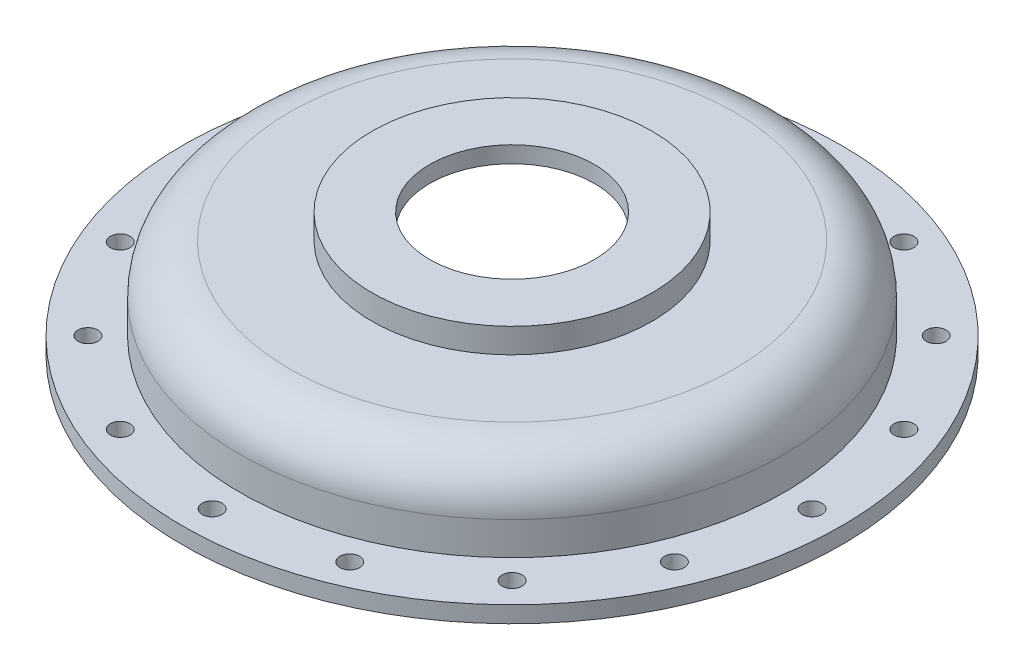
ISO-10303-21;
HEADER;
FILE_DESCRIPTION(('STEP AP214'),'2;1');
FILE_NAME('part.step','',(''),(''),'','','');
FILE_SCHEMA(('AUTOMOTIVE_DESIGN { 1 0 10303 214 1 1 1 1 }'));
ENDSEC;
DATA;
#1=APPLICATION_CONTEXT('core data for automotive mechanical design processes');
#2=APPLICATION_PROTOCOL_DEFINITION('international standard','automotive_design',2000,#1);
#3=PRODUCT_CONTEXT('',#1,'mechanical');
#4=PRODUCT('Part','Part','',(#3));
#5=PRODUCT_RELATED_PRODUCT_CATEGORY('part','',(#4));
#6=PRODUCT_DEFINITION_FORMATION('','',#4);
#7=PRODUCT_DEFINITION_CONTEXT('part definition',#1,'design');
#8=PRODUCT_DEFINITION('design','',#6,#7);
#9=PRODUCT_DEFINITION_SHAPE('','',#8);
#10=(LENGTH_UNIT() NAMED_UNIT(*) SI_UNIT(.MILLI.,.METRE.));
#11=(NAMED_UNIT(*) PLANE_ANGLE_UNIT() SI_UNIT($,.RADIAN.));
#12=(NAMED_UNIT(*) SI_UNIT($,.STERADIAN.) SOLID_ANGLE_UNIT());
#13=UNCERTAINTY_MEASURE_WITH_UNIT(LENGTH_MEASURE(1.E-05),#10,'distance_accuracy_value','');
#14=(GEOMETRIC_REPRESENTATION_CONTEXT(3) GLOBAL_UNCERTAINTY_ASSIGNED_CONTEXT((#13)) GLOBAL_UNIT_ASSIGNED_CONTEXT((#10,
#11,#12)) REPRESENTATION_CONTEXT('',''));
#15=CARTESIAN_POINT('',(0.,0.,0.));
#16=DIRECTION('',(0.,0.,1.));
#17=DIRECTION('',(1.,0.,0.));
#18=AXIS2_PLACEMENT_3D('',#15,#16,#17);
#19=CARTESIAN_POINT('',(1905.,1651.,0.));
#20=DIRECTION('',(0.,-1.,0.));
#21=DIRECTION('',(0.,0.,-1.));
#22=AXIS2_PLACEMENT_3D('',#19,#20,#21);
#23=PLANE('',#22);
#24=CARTESIAN_POINT('',(0.,1651.,0.));
#25=DIRECTION('',(0.,-1.,0.));
#26=DIRECTION('',(0.,0.,-1.));
#27=AXIS2_PLACEMENT_3D('',#24,#25,#26);
#28=CIRCLE('',#27,1270.);
#29=CARTESIAN_POINT('',(0.,1651.,-1270.));
#30=VERTEX_POINT('',#29);
#31=EDGE_CURVE('E80',#30,#30,#28,.T.);
#32=ORIENTED_EDGE('',*,*,#31,.F.);
#33=EDGE_LOOP('',(#32));
#34=FACE_BOUND('',#33,.T.);
#35=CARTESIAN_POINT('',(0.,1651.,0.));
#36=DIRECTION('',(0.,-1.,0.));
#37=DIRECTION('',(0.,0.,-1.));
#38=AXIS2_PLACEMENT_3D('',#35,#36,#37);
#39=CIRCLE('',#38,1905.);
#40=CARTESIAN_POINT('',(0.,1651.,-1905.));
#41=VERTEX_POINT('',#40);
#42=EDGE_CURVE('E10',#41,#41,#39,.T.);
#43=ORIENTED_EDGE('',*,*,#42,.T.);
#44=EDGE_LOOP('',(#43));
#45=FACE_BOUND('',#44,.T.);
#46=ADVANCED_FACE('F37',(#34,#45),#23,.T.);
#47=CARTESIAN_POINT('',(0.,0.,0.));
#48=DIRECTION('',(0.,-1.,0.));
#49=DIRECTION('',(0.,0.,-1.));
#50=AXIS2_PLACEMENT_3D('',#47,#48,#49);
#51=CYLINDRICAL_SURFACE('',#50,1905.);
#52=CARTESIAN_POINT('',(0.,1270.,0.));
#53=DIRECTION('',(0.,-1.,0.));
#54=DIRECTION('',(0.,0.,-1.));
#55=AXIS2_PLACEMENT_3D('',#52,#53,#54);
#56=CIRCLE('',#55,1905.);
#57=CARTESIAN_POINT('',(0.,1270.,-1905.));
#58=VERTEX_POINT('',#57);
#59=EDGE_CURVE('E43',#58,#58,#56,.T.);
#60=ORIENTED_EDGE('',*,*,#59,.T.);
#61=EDGE_LOOP('',(#60));
#62=FACE_BOUND('',#61,.T.);
#63=ORIENTED_EDGE('',*,*,#42,.F.);
#64=EDGE_LOOP('',(#63));
#65=FACE_BOUND('',#64,.T.);
#66=ADVANCED_FACE('F245',(#62,#65),#51,.F.);
#67=CARTESIAN_POINT('',(3174.99999999999,1270.,0.));
#68=DIRECTION('',(0.,-1.,0.));
#69=DIRECTION('',(0.,0.,-1.));
#70=AXIS2_PLACEMENT_3D('',#67,#68,#69);
#71=PLANE('',#70);
#72=CARTESIAN_POINT('',(0.,1270.,0.));
#73=DIRECTION('',(0.,-1.,0.));
#74=DIRECTION('',(0.,0.,-1.));
#75=AXIS2_PLACEMENT_3D('',#72,#73,#74);
#76=CIRCLE('',#75,3174.99999999999);
#77=CARTESIAN_POINT('',(0.,1270.,-3174.99999999999));
#78=VERTEX_POINT('',#77);
#79=EDGE_CURVE('E47',#78,#78,#76,.T.);
#80=ORIENTED_EDGE('',*,*,#79,.T.);
#81=EDGE_LOOP('',(#80));
#82=FACE_BOUND('',#81,.T.);
#83=ORIENTED_EDGE('',*,*,#59,.F.);
#84=EDGE_LOOP('',(#83));
#85=FACE_BOUND('',#84,.T.);
#86=ADVANCED_FACE('F239',(#82,#85),#71,.T.);
#87=CARTESIAN_POINT('',(0.,507.999999999999,0.));
#88=DIRECTION('',(0.,-1.,0.));
#89=DIRECTION('',(0.,0.,-1.));
#90=AXIS2_PLACEMENT_3D('',#87,#88,#89);
#91=TOROIDAL_SURFACE('',#90,3175.,762.);
#92=CARTESIAN_POINT('',(0.,507.999999999993,0.));
#93=DIRECTION('',(0.,-1.,0.));
#94=DIRECTION('',(0.,0.,-1.));
#95=AXIS2_PLACEMENT_3D('',#92,#93,#94);
#96=CIRCLE('',#95,3937.);
#97=CARTESIAN_POINT('',(0.,507.999999999993,-3937.));
#98=VERTEX_POINT('',#97);
#99=EDGE_CURVE('E51',#98,#98,#96,.T.);
#100=ORIENTED_EDGE('',*,*,#99,.T.);
#101=EDGE_LOOP('',(#100));
#102=FACE_BOUND('',#101,.T.);
#103=ORIENTED_EDGE('',*,*,#79,.F.);
#104=EDGE_LOOP('',(#103));
#105=FACE_BOUND('',#104,.T.);
#106=ADVANCED_FACE('F233',(#102,#105),#91,.F.);
#107=CARTESIAN_POINT('',(0.,0.,0.));
#108=DIRECTION('',(0.,-1.,0.));
#109=DIRECTION('',(0.,0.,-1.));
#110=AXIS2_PLACEMENT_3D('',#107,#108,#109);
#111=CYLINDRICAL_SURFACE('',#110,3937.);
#112=CARTESIAN_POINT('',(0.,-1.39977129142543E-13,0.));
#113=DIRECTION('',(0.,-1.,0.));
#114=DIRECTION('',(0.,0.,-1.));
#115=AXIS2_PLACEMENT_3D('',#112,#113,#114);
#116=CIRCLE('',#115,3937.);
#117=CARTESIAN_POINT('',(0.,-1.39977129142543E-13,-3937.));
#118=VERTEX_POINT('',#117);
#119=EDGE_CURVE('E56',#118,#118,#116,.T.);
#120=ORIENTED_EDGE('',*,*,#119,.T.);
#121=EDGE_LOOP('',(#120));
#122=FACE_BOUND('',#121,.T.);
#123=ORIENTED_EDGE('',*,*,#99,.F.);
#124=EDGE_LOOP('',(#123));
#125=FACE_BOUND('',#124,.T.);
#126=ADVANCED_FACE('F226',(#122,#125),#111,.F.);
#127=CARTESIAN_POINT('',(5080.,0.,0.));
#128=DIRECTION('',(0.,-1.,0.));
#129=DIRECTION('',(0.,0.,-1.));
#130=AXIS2_PLACEMENT_3D('',#127,#128,#129);
#131=PLANE('',#130);
#132=CARTESIAN_POINT('',(3268.81322806918,-1.66533453693773E-13,-3268.81322806917));
#133=DIRECTION('',(0.,1.,0.));
#134=DIRECTION('',(-0.707106781186549,0.,0.707106781186546));
#135=AXIS2_PLACEMENT_3D('',#132,#133,#134);
#136=CIRCLE('',#135,152.4);
#137=CARTESIAN_POINT('',(3161.05015461635,-1.66533453693773E-13,-3161.05015461634));
#138=VERTEX_POINT('',#137);
#139=EDGE_CURVE('E96',#138,#138,#136,.T.);
#140=ORIENTED_EDGE('',*,*,#139,.T.);
#141=EDGE_LOOP('',(#140));
#142=FACE_BOUND('',#141,.T.);
#143=CARTESIAN_POINT('',(4270.91030289318,-1.66533453693773E-13,-1769.06897113733));
#144=DIRECTION('',(0.,1.,0.));
#145=DIRECTION('',(-0.923879532511288,0.,0.382683432365087));
#146=AXIS2_PLACEMENT_3D('',#143,#144,#145);
#147=CIRCLE('',#146,152.4);
#148=CARTESIAN_POINT('',(4130.11106213846,-1.66533453693773E-13,-1710.74801604489));
#149=VERTEX_POINT('',#148);
#150=EDGE_CURVE('E139',#149,#149,#147,.T.);
#151=ORIENTED_EDGE('',*,*,#150,.T.);
#152=EDGE_LOOP('',(#151));
#153=FACE_BOUND('',#152,.T.);
#154=CARTESIAN_POINT('',(4622.8,-1.66533453693773E-13,1.6140419933204E-11));
#155=DIRECTION('',(0.,1.,0.));
#156=DIRECTION('',(-1.,0.,0.));
#157=AXIS2_PLACEMENT_3D('',#154,#155,#156);
#158=CIRCLE('',#157,152.4);
#159=CARTESIAN_POINT('',(4470.4,-1.66533453693773E-13,1.56083181771643E-11));
#160=VERTEX_POINT('',#159);
#161=EDGE_CURVE('E133',#160,#160,#158,.T.);
#162=ORIENTED_EDGE('',*,*,#161,.T.);
#163=EDGE_LOOP('',(#162));
#164=FACE_BOUND('',#163,.T.);
#165=CARTESIAN_POINT('',(4270.91030289317,-1.66533453693773E-13,1769.06897113736));
#166=DIRECTION('',(0.,1.,0.));
#167=DIRECTION('',(-0.923879532511285,0.,-0.382683432365094));
#168=AXIS2_PLACEMENT_3D('',#165,#166,#167);
#169=CIRCLE('',#168,152.4);
#170=CARTESIAN_POINT('',(4130.11106213845,-1.66533453693773E-13,1710.74801604492));
#171=VERTEX_POINT('',#170);
#172=EDGE_CURVE('E127',#171,#171,#169,.T.);
#173=ORIENTED_EDGE('',*,*,#172,.T.);
#174=EDGE_LOOP('',(#173));
#175=FACE_BOUND('',#174,.T.);
#176=CARTESIAN_POINT('',(3268.81322806915,-1.66533453693773E-13,3268.81322806919));
#177=DIRECTION('',(0.,1.,0.));
#178=DIRECTION('',(-0.707106781186544,0.,-0.707106781186551));
#179=AXIS2_PLACEMENT_3D('',#176,#177,#178);
#180=CIRCLE('',#179,152.4);
#181=CARTESIAN_POINT('',(3161.05015461633,-1.66533453693773E-13,3161.05015461636));
#182=VERTEX_POINT('',#181);
#183=EDGE_CURVE('E121',#182,#182,#180,.T.);
#184=ORIENTED_EDGE('',*,*,#183,.T.);
#185=EDGE_LOOP('',(#184));
#186=FACE_BOUND('',#185,.T.);
#187=CARTESIAN_POINT('',(1769.06897113731,-1.66533453693773E-13,4270.91030289319));
#188=DIRECTION('',(0.,1.,0.));
#189=DIRECTION('',(-0.382683432365084,0.,-0.923879532511289));
#190=AXIS2_PLACEMENT_3D('',#187,#188,#189);
#191=CIRCLE('',#190,152.4);
#192=CARTESIAN_POINT('',(1710.74801604487,-1.66533453693773E-13,4130.11106213847));
#193=VERTEX_POINT('',#192);
#194=EDGE_CURVE('E115',#193,#193,#191,.T.);
#195=ORIENTED_EDGE('',*,*,#194,.T.);
#196=EDGE_LOOP('',(#195));
#197=FACE_BOUND('',#196,.T.);
#198=CARTESIAN_POINT('',(0.,-1.66533453693773E-13,4622.8));
#199=DIRECTION('',(0.,1.,0.));
#200=DIRECTION('',(0.,0.,-1.));
#201=AXIS2_PLACEMENT_3D('',#198,#199,#200);
#202=CIRCLE('',#201,152.4);
#203=CARTESIAN_POINT('',(0.,-1.66533453693773E-13,4470.4));
#204=VERTEX_POINT('',#203);
#205=EDGE_CURVE('E109',#204,#204,#202,.T.);
#206=ORIENTED_EDGE('',*,*,#205,.T.);
#207=EDGE_LOOP('',(#206));
#208=FACE_BOUND('',#207,.T.);
#209=CARTESIAN_POINT('',(-1769.06897113737,-1.66533453693773E-13,4270.91030289316));
#210=DIRECTION('',(0.,1.,0.));
#211=DIRECTION('',(0.382683432365097,0.,-0.923879532511284));
#212=AXIS2_PLACEMENT_3D('',#209,#210,#211);
#213=CIRCLE('',#212,152.4);
#214=CARTESIAN_POINT('',(-1710.74801604493,-1.66533453693773E-13,4130.11106213844));
#215=VERTEX_POINT('',#214);
#216=EDGE_CURVE('E102',#215,#215,#213,.T.);
#217=ORIENTED_EDGE('',*,*,#216,.T.);
#218=EDGE_LOOP('',(#217));
#219=FACE_BOUND('',#218,.T.);
#220=CARTESIAN_POINT('',(-3268.8132280692,-1.66533453693773E-13,3268.81322806914));
#221=DIRECTION('',(0.,1.,0.));
#222=DIRECTION('',(0.707106781186554,0.,-0.707106781186541));
#223=AXIS2_PLACEMENT_3D('',#220,#221,#222);
#224=CIRCLE('',#223,152.4);
#225=CARTESIAN_POINT('',(-3161.05015461637,-1.66533453693773E-13,3161.05015461631));
#226=VERTEX_POINT('',#225);
#227=EDGE_CURVE('E103',#226,#226,#224,.T.);
#228=ORIENTED_EDGE('',*,*,#227,.T.);
#229=EDGE_LOOP('',(#228));
#230=FACE_BOUND('',#229,.T.);
#231=CARTESIAN_POINT('',(-4270.91030289319,-1.66533453693773E-13,1769.06897113729));
#232=DIRECTION('',(0.,1.,0.));
#233=DIRECTION('',(0.923879532511291,0.,-0.382683432365081));
#234=AXIS2_PLACEMENT_3D('',#231,#232,#233);
#235=CIRCLE('',#234,152.4);
#236=CARTESIAN_POINT('',(-4130.11106213847,-1.66533453693773E-13,1710.74801604486));
#237=VERTEX_POINT('',#236);
#238=EDGE_CURVE('E174',#237,#237,#235,.T.);
#239=ORIENTED_EDGE('',*,*,#238,.T.);
#240=EDGE_LOOP('',(#239));
#241=FACE_BOUND('',#240,.T.);
#242=CARTESIAN_POINT('',(-4622.8,-1.66533453693773E-13,-4.84212597996121E-11));
#243=DIRECTION('',(0.,1.,0.));
#244=DIRECTION('',(1.,0.,0.));
#245=AXIS2_PLACEMENT_3D('',#242,#243,#244);
#246=CIRCLE('',#245,152.4);
#247=CARTESIAN_POINT('',(-4470.4,-1.66533453693773E-13,-4.6824954531493E-11));
#248=VERTEX_POINT('',#247);
#249=EDGE_CURVE('E168',#248,#248,#246,.T.);
#250=ORIENTED_EDGE('',*,*,#249,.T.);
#251=EDGE_LOOP('',(#250));
#252=FACE_BOUND('',#251,.T.);
#253=CARTESIAN_POINT('',(-4270.91030289316,-1.66533453693773E-13,-1769.06897113738));
#254=DIRECTION('',(0.,1.,0.));
#255=DIRECTION('',(0.923879532511283,0.,0.3826834323651));
#256=AXIS2_PLACEMENT_3D('',#253,#254,#255);
#257=CIRCLE('',#256,152.4);
#258=CARTESIAN_POINT('',(-4130.11106213844,-1.66533453693773E-13,-1710.74801604494));
#259=VERTEX_POINT('',#258);
#260=EDGE_CURVE('E162',#259,#259,#257,.T.);
#261=ORIENTED_EDGE('',*,*,#260,.T.);
#262=EDGE_LOOP('',(#261));
#263=FACE_BOUND('',#262,.T.);
#264=CARTESIAN_POINT('',(-3268.81322806913,-1.66533453693773E-13,-3268.81322806921));
#265=DIRECTION('',(0.,1.,0.));
#266=DIRECTION('',(0.707106781186539,0.,0.707106781186556));
#267=AXIS2_PLACEMENT_3D('',#264,#265,#266);
#268=CIRCLE('',#267,152.4);
#269=CARTESIAN_POINT('',(-3161.0501546163,-1.66533453693773E-13,-3161.05015461638));
#270=VERTEX_POINT('',#269);
#271=EDGE_CURVE('E156',#270,#270,#268,.T.);
#272=ORIENTED_EDGE('',*,*,#271,.T.);
#273=EDGE_LOOP('',(#272));
#274=FACE_BOUND('',#273,.T.);
#275=CARTESIAN_POINT('',(-1769.06897113728,-1.66533453693773E-13,-4270.9103028932));
#276=DIRECTION('',(0.,1.,0.));
#277=DIRECTION('',(0.382683432365077,0.,0.923879532511292));
#278=AXIS2_PLACEMENT_3D('',#275,#276,#277);
#279=CIRCLE('',#278,152.4);
#280=CARTESIAN_POINT('',(-1710.74801604484,-1.66533453693773E-13,-4130.11106213848));
#281=VERTEX_POINT('',#280);
#282=EDGE_CURVE('E150',#281,#281,#279,.T.);
#283=ORIENTED_EDGE('',*,*,#282,.T.);
#284=EDGE_LOOP('',(#283));
#285=FACE_BOUND('',#284,.T.);
#286=CARTESIAN_POINT('',(1769.06897113734,-1.66533453693773E-13,-4270.91030289317));
#287=DIRECTION('',(0.,1.,0.));
#288=DIRECTION('',(-0.382683432365091,0.,0.923879532511287));
#289=AXIS2_PLACEMENT_3D('',#286,#287,#288);
#290=CIRCLE('',#289,152.4);
#291=CARTESIAN_POINT('',(1710.7480160449,-1.66533453693773E-13,-4130.11106213846));
#292=VERTEX_POINT('',#291);
#293=EDGE_CURVE('E90',#292,#292,#290,.T.);
#294=ORIENTED_EDGE('',*,*,#293,.T.);
#295=EDGE_LOOP('',(#294));
#296=FACE_BOUND('',#295,.T.);
#297=CARTESIAN_POINT('',(0.,-1.66533453693773E-13,-4622.8));
#298=DIRECTION('',(0.,1.,0.));
#299=DIRECTION('',(0.,0.,1.));
#300=AXIS2_PLACEMENT_3D('',#297,#298,#299);
#301=CIRCLE('',#300,152.4);
#302=CARTESIAN_POINT('',(0.,-1.66533453693773E-13,-4470.4));
#303=VERTEX_POINT('',#302);
#304=EDGE_CURVE('E86',#303,#303,#301,.T.);
#305=ORIENTED_EDGE('',*,*,#304,.T.);
#306=EDGE_LOOP('',(#305));
#307=FACE_BOUND('',#306,.T.);
#308=CARTESIAN_POINT('',(0.,1.11022302462516E-13,0.));
#309=DIRECTION('',(0.,-1.,0.));
#310=DIRECTION('',(0.,0.,-1.));
#311=AXIS2_PLACEMENT_3D('',#308,#309,#310);
#312=CIRCLE('',#311,5080.);
#313=CARTESIAN_POINT('',(0.,1.11022302462516E-13,-5080.));
#314=VERTEX_POINT('',#313);
#315=EDGE_CURVE('E59',#314,#314,#312,.T.);
#316=ORIENTED_EDGE('',*,*,#315,.T.);
#317=EDGE_LOOP('',(#316));
#318=FACE_BOUND('',#317,.T.);
#319=ORIENTED_EDGE('',*,*,#119,.F.);
#320=EDGE_LOOP('',(#319));
#321=FACE_BOUND('',#320,.T.);
#322=ADVANCED_FACE('F183',(#142,#153,#164,#175,#186,#197,#208,#219,#230,#241,#252,#263,#274,
#285,#296,#307,#318,#321),#131,.T.);
#323=CARTESIAN_POINT('',(0.,0.,0.));
#324=DIRECTION('',(0.,-1.,0.));
#325=DIRECTION('',(0.,0.,-1.));
#326=AXIS2_PLACEMENT_3D('',#323,#324,#325);
#327=CYLINDRICAL_SURFACE('',#326,5080.);
#328=CARTESIAN_POINT('',(0.,254.,0.));
#329=DIRECTION('',(0.,-1.,0.));
#330=DIRECTION('',(0.,0.,-1.));
#331=AXIS2_PLACEMENT_3D('',#328,#329,#330);
#332=CIRCLE('',#331,5080.);
#333=CARTESIAN_POINT('',(0.,254.,-5080.));
#334=VERTEX_POINT('',#333);
#335=EDGE_CURVE('E62',#334,#334,#332,.T.);
#336=ORIENTED_EDGE('',*,*,#335,.T.);
#337=EDGE_LOOP('',(#336));
#338=FACE_BOUND('',#337,.T.);
#339=ORIENTED_EDGE('',*,*,#315,.F.);
#340=EDGE_LOOP('',(#339));
#341=FACE_BOUND('',#340,.T.);
#342=ADVANCED_FACE('F198',(#338,#341),#327,.T.);
#343=CARTESIAN_POINT('',(4191.,254.,0.));
#344=DIRECTION('',(0.,1.,0.));
#345=DIRECTION('',(0.,0.,1.));
#346=AXIS2_PLACEMENT_3D('',#343,#344,#345);
#347=PLANE('',#346);
#348=CARTESIAN_POINT('',(3268.81322806918,254.,-3268.81322806917));
#349=DIRECTION('',(0.,1.,0.));
#350=DIRECTION('',(-0.707106781186549,0.,0.707106781186546));
#351=AXIS2_PLACEMENT_3D('',#348,#349,#350);
#352=CIRCLE('',#351,152.4);
#353=CARTESIAN_POINT('',(3161.05015461635,254.,-3161.05015461634));
#354=VERTEX_POINT('',#353);
#355=EDGE_CURVE('E142',#354,#354,#352,.T.);
#356=ORIENTED_EDGE('',*,*,#355,.F.);
#357=EDGE_LOOP('',(#356));
#358=FACE_BOUND('',#357,.T.);
#359=CARTESIAN_POINT('',(4270.91030289318,254.,-1769.06897113733));
#360=DIRECTION('',(0.,1.,0.));
#361=DIRECTION('',(-0.923879532511288,0.,0.382683432365087));
#362=AXIS2_PLACEMENT_3D('',#359,#360,#361);
#363=CIRCLE('',#362,152.4);
#364=CARTESIAN_POINT('',(4130.11106213846,254.,-1710.74801604489));
#365=VERTEX_POINT('',#364);
#366=EDGE_CURVE('E136',#365,#365,#363,.T.);
#367=ORIENTED_EDGE('',*,*,#366,.F.);
#368=EDGE_LOOP('',(#367));
#369=FACE_BOUND('',#368,.T.);
#370=CARTESIAN_POINT('',(4622.8,254.,1.6140419933204E-11));
#371=DIRECTION('',(0.,1.,0.));
#372=DIRECTION('',(-1.,0.,0.));
#373=AXIS2_PLACEMENT_3D('',#370,#371,#372);
#374=CIRCLE('',#373,152.4);
#375=CARTESIAN_POINT('',(4470.4,254.,1.56083181771643E-11));
#376=VERTEX_POINT('',#375);
#377=EDGE_CURVE('E130',#376,#376,#374,.T.);
#378=ORIENTED_EDGE('',*,*,#377,.F.);
#379=EDGE_LOOP('',(#378));
#380=FACE_BOUND('',#379,.T.);
#381=CARTESIAN_POINT('',(4270.91030289317,254.,1769.06897113736));
#382=DIRECTION('',(0.,1.,0.));
#383=DIRECTION('',(-0.923879532511285,0.,-0.382683432365094));
#384=AXIS2_PLACEMENT_3D('',#381,#382,#383);
#385=CIRCLE('',#384,152.4);
#386=CARTESIAN_POINT('',(4130.11106213845,254.,1710.74801604492));
#387=VERTEX_POINT('',#386);
#388=EDGE_CURVE('E124',#387,#387,#385,.T.);
#389=ORIENTED_EDGE('',*,*,#388,.F.);
#390=EDGE_LOOP('',(#389));
#391=FACE_BOUND('',#390,.T.);
#392=CARTESIAN_POINT('',(3268.81322806915,254.,3268.81322806919));
#393=DIRECTION('',(0.,1.,0.));
#394=DIRECTION('',(-0.707106781186544,0.,-0.707106781186551));
#395=AXIS2_PLACEMENT_3D('',#392,#393,#394);
#396=CIRCLE('',#395,152.4);
#397=CARTESIAN_POINT('',(3161.05015461633,254.,3161.05015461636));
#398=VERTEX_POINT('',#397);
#399=EDGE_CURVE('E118',#398,#398,#396,.T.);
#400=ORIENTED_EDGE('',*,*,#399,.F.);
#401=EDGE_LOOP('',(#400));
#402=FACE_BOUND('',#401,.T.);
#403=CARTESIAN_POINT('',(1769.06897113731,254.,4270.91030289319));
#404=DIRECTION('',(0.,1.,0.));
#405=DIRECTION('',(-0.382683432365084,0.,-0.923879532511289));
#406=AXIS2_PLACEMENT_3D('',#403,#404,#405);
#407=CIRCLE('',#406,152.4);
#408=CARTESIAN_POINT('',(1710.74801604487,254.,4130.11106213847));
#409=VERTEX_POINT('',#408);
#410=EDGE_CURVE('E112',#409,#409,#407,.T.);
#411=ORIENTED_EDGE('',*,*,#410,.F.);
#412=EDGE_LOOP('',(#411));
#413=FACE_BOUND('',#412,.T.);
#414=CARTESIAN_POINT('',(0.,254.,4622.8));
#415=DIRECTION('',(0.,1.,0.));
#416=DIRECTION('',(0.,0.,-1.));
#417=AXIS2_PLACEMENT_3D('',#414,#415,#416);
#418=CIRCLE('',#417,152.4);
#419=CARTESIAN_POINT('',(0.,254.,4470.4));
#420=VERTEX_POINT('',#419);
#421=EDGE_CURVE('E106',#420,#420,#418,.T.);
#422=ORIENTED_EDGE('',*,*,#421,.F.);
#423=EDGE_LOOP('',(#422));
#424=FACE_BOUND('',#423,.T.);
#425=CARTESIAN_POINT('',(-1769.06897113737,254.,4270.91030289316));
#426=DIRECTION('',(0.,1.,0.));
#427=DIRECTION('',(0.382683432365097,0.,-0.923879532511284));
#428=AXIS2_PLACEMENT_3D('',#425,#426,#427);
#429=CIRCLE('',#428,152.4);
#430=CARTESIAN_POINT('',(-1710.74801604493,254.,4130.11106213844));
#431=VERTEX_POINT('',#430);
#432=EDGE_CURVE('E99',#431,#431,#429,.T.);
#433=ORIENTED_EDGE('',*,*,#432,.F.);
#434=EDGE_LOOP('',(#433));
#435=FACE_BOUND('',#434,.T.);
#436=CARTESIAN_POINT('',(-3268.8132280692,254.,3268.81322806914));
#437=DIRECTION('',(0.,1.,0.));
#438=DIRECTION('',(0.707106781186554,0.,-0.707106781186541));
#439=AXIS2_PLACEMENT_3D('',#436,#437,#438);
#440=CIRCLE('',#439,152.4);
#441=CARTESIAN_POINT('',(-3161.05015461637,254.,3161.05015461631));
#442=VERTEX_POINT('',#441);
#443=EDGE_CURVE('E177',#442,#442,#440,.T.);
#444=ORIENTED_EDGE('',*,*,#443,.F.);
#445=EDGE_LOOP('',(#444));
#446=FACE_BOUND('',#445,.T.);
#447=CARTESIAN_POINT('',(-4270.91030289319,254.,1769.06897113729));
#448=DIRECTION('',(0.,1.,0.));
#449=DIRECTION('',(0.923879532511291,0.,-0.382683432365081));
#450=AXIS2_PLACEMENT_3D('',#447,#448,#449);
#451=CIRCLE('',#450,152.4);
#452=CARTESIAN_POINT('',(-4130.11106213847,254.,1710.74801604486));
#453=VERTEX_POINT('',#452);
#454=EDGE_CURVE('E171',#453,#453,#451,.T.);
#455=ORIENTED_EDGE('',*,*,#454,.F.);
#456=EDGE_LOOP('',(#455));
#457=FACE_BOUND('',#456,.T.);
#458=CARTESIAN_POINT('',(-4622.8,254.,-4.84212597996121E-11));
#459=DIRECTION('',(0.,1.,0.));
#460=DIRECTION('',(1.,0.,0.));
#461=AXIS2_PLACEMENT_3D('',#458,#459,#460);
#462=CIRCLE('',#461,152.4);
#463=CARTESIAN_POINT('',(-4470.4,254.,-4.6824954531493E-11));
#464=VERTEX_POINT('',#463);
#465=EDGE_CURVE('E165',#464,#464,#462,.T.);
#466=ORIENTED_EDGE('',*,*,#465,.F.);
#467=EDGE_LOOP('',(#466));
#468=FACE_BOUND('',#467,.T.);
#469=CARTESIAN_POINT('',(-4270.91030289316,254.,-1769.06897113738));
#470=DIRECTION('',(0.,1.,0.));
#471=DIRECTION('',(0.923879532511283,0.,0.3826834323651));
#472=AXIS2_PLACEMENT_3D('',#469,#470,#471);
#473=CIRCLE('',#472,152.4);
#474=CARTESIAN_POINT('',(-4130.11106213844,254.,-1710.74801604494));
#475=VERTEX_POINT('',#474);
#476=EDGE_CURVE('E159',#475,#475,#473,.T.);
#477=ORIENTED_EDGE('',*,*,#476,.F.);
#478=EDGE_LOOP('',(#477));
#479=FACE_BOUND('',#478,.T.);
#480=CARTESIAN_POINT('',(-3268.81322806913,254.,-3268.81322806921));
#481=DIRECTION('',(0.,1.,0.));
#482=DIRECTION('',(0.707106781186539,0.,0.707106781186556));
#483=AXIS2_PLACEMENT_3D('',#480,#481,#482);
#484=CIRCLE('',#483,152.4);
#485=CARTESIAN_POINT('',(-3161.0501546163,254.,-3161.05015461638));
#486=VERTEX_POINT('',#485);
#487=EDGE_CURVE('E153',#486,#486,#484,.T.);
#488=ORIENTED_EDGE('',*,*,#487,.F.);
#489=EDGE_LOOP('',(#488));
#490=FACE_BOUND('',#489,.T.);
#491=CARTESIAN_POINT('',(-1769.06897113728,254.,-4270.9103028932));
#492=DIRECTION('',(0.,1.,0.));
#493=DIRECTION('',(0.382683432365077,0.,0.923879532511292));
#494=AXIS2_PLACEMENT_3D('',#491,#492,#493);
#495=CIRCLE('',#494,152.4);
#496=CARTESIAN_POINT('',(-1710.74801604484,254.,-4130.11106213848));
#497=VERTEX_POINT('',#496);
#498=EDGE_CURVE('E147',#497,#497,#495,.T.);
#499=ORIENTED_EDGE('',*,*,#498,.F.);
#500=EDGE_LOOP('',(#499));
#501=FACE_BOUND('',#500,.T.);
#502=CARTESIAN_POINT('',(1769.06897113734,254.,-4270.91030289317));
#503=DIRECTION('',(0.,1.,0.));
#504=DIRECTION('',(-0.382683432365091,0.,0.923879532511287));
#505=AXIS2_PLACEMENT_3D('',#502,#503,#504);
#506=CIRCLE('',#505,152.4);
#507=CARTESIAN_POINT('',(1710.7480160449,254.,-4130.11106213846));
#508=VERTEX_POINT('',#507);
#509=EDGE_CURVE('E93',#508,#508,#506,.T.);
#510=ORIENTED_EDGE('',*,*,#509,.F.);
#511=EDGE_LOOP('',(#510));
#512=FACE_BOUND('',#511,.T.);
#513=CARTESIAN_POINT('',(0.,254.,-4622.8));
#514=DIRECTION('',(0.,1.,0.));
#515=DIRECTION('',(0.,0.,1.));
#516=AXIS2_PLACEMENT_3D('',#513,#514,#515);
#517=CIRCLE('',#516,152.4);
#518=CARTESIAN_POINT('',(0.,254.,-4470.4));
#519=VERTEX_POINT('',#518);
#520=EDGE_CURVE('E87',#519,#519,#517,.T.);
#521=ORIENTED_EDGE('',*,*,#520,.F.);
#522=EDGE_LOOP('',(#521));
#523=FACE_BOUND('',#522,.T.);
#524=CARTESIAN_POINT('',(0.,254.,0.));
#525=DIRECTION('',(0.,-1.,0.));
#526=DIRECTION('',(0.,0.,-1.));
#527=AXIS2_PLACEMENT_3D('',#524,#525,#526);
#528=CIRCLE('',#527,4191.);
#529=CARTESIAN_POINT('',(0.,254.,-4191.));
#530=VERTEX_POINT('',#529);
#531=EDGE_CURVE('E65',#530,#530,#528,.T.);
#532=ORIENTED_EDGE('',*,*,#531,.T.);
#533=EDGE_LOOP('',(#532));
#534=FACE_BOUND('',#533,.T.);
#535=ORIENTED_EDGE('',*,*,#335,.F.);
#536=EDGE_LOOP('',(#535));
#537=FACE_BOUND('',#536,.T.);
#538=ADVANCED_FACE('F194',(#358,#369,#380,#391,#402,#413,#424,#435,#446,#457,#468,#479,#490,
#501,#512,#523,#534,#537),#347,.T.);
#539=CARTESIAN_POINT('',(0.,0.,0.));
#540=DIRECTION('',(0.,-1.,0.));
#541=DIRECTION('',(0.,0.,-1.));
#542=AXIS2_PLACEMENT_3D('',#539,#540,#541);
#543=CYLINDRICAL_SURFACE('',#542,4191.);
#544=CARTESIAN_POINT('',(0.,761.999999999994,0.));
#545=DIRECTION('',(0.,-1.,0.));
#546=DIRECTION('',(0.,0.,-1.));
#547=AXIS2_PLACEMENT_3D('',#544,#545,#546);
#548=CIRCLE('',#547,4191.);
#549=CARTESIAN_POINT('',(0.,761.999999999994,-4191.));
#550=VERTEX_POINT('',#549);
#551=EDGE_CURVE('E68',#550,#550,#548,.T.);
#552=ORIENTED_EDGE('',*,*,#551,.T.);
#553=EDGE_LOOP('',(#552));
#554=FACE_BOUND('',#553,.T.);
#555=ORIENTED_EDGE('',*,*,#531,.F.);
#556=EDGE_LOOP('',(#555));
#557=FACE_BOUND('',#556,.T.);
#558=ADVANCED_FACE('F197',(#554,#557),#543,.T.);
#559=CARTESIAN_POINT('',(0.,762.,0.));
#560=DIRECTION('',(0.,-1.,0.));
#561=DIRECTION('',(0.,0.,-1.));
#562=AXIS2_PLACEMENT_3D('',#559,#560,#561);
#563=TOROIDAL_SURFACE('',#562,3429.,762.);
#564=CARTESIAN_POINT('',(0.,1524.,0.));
#565=DIRECTION('',(0.,-1.,0.));
#566=DIRECTION('',(0.,0.,-1.));
#567=AXIS2_PLACEMENT_3D('',#564,#565,#566);
#568=CIRCLE('',#567,3428.99999999999);
#569=CARTESIAN_POINT('',(0.,1524.,-3428.99999999999));
#570=VERTEX_POINT('',#569);
#571=EDGE_CURVE('E71',#570,#570,#568,.T.);
#572=ORIENTED_EDGE('',*,*,#571,.T.);
#573=EDGE_LOOP('',(#572));
#574=FACE_BOUND('',#573,.T.);
#575=ORIENTED_EDGE('',*,*,#551,.F.);
#576=EDGE_LOOP('',(#575));
#577=FACE_BOUND('',#576,.T.);
#578=ADVANCED_FACE('F278',(#574,#577),#563,.T.);
#579=CARTESIAN_POINT('',(2159.,1524.,0.));
#580=DIRECTION('',(0.,1.,0.));
#581=DIRECTION('',(0.,0.,1.));
#582=AXIS2_PLACEMENT_3D('',#579,#580,#581);
#583=PLANE('',#582);
#584=CARTESIAN_POINT('',(0.,1524.,0.));
#585=DIRECTION('',(0.,-1.,0.));
#586=DIRECTION('',(0.,0.,-1.));
#587=AXIS2_PLACEMENT_3D('',#584,#585,#586);
#588=CIRCLE('',#587,2159.);
#589=CARTESIAN_POINT('',(0.,1524.,-2159.));
#590=VERTEX_POINT('',#589);
#591=EDGE_CURVE('E74',#590,#590,#588,.T.);
#592=ORIENTED_EDGE('',*,*,#591,.T.);
#593=EDGE_LOOP('',(#592));
#594=FACE_BOUND('',#593,.T.);
#595=ORIENTED_EDGE('',*,*,#571,.F.);
#596=EDGE_LOOP('',(#595));
#597=FACE_BOUND('',#596,.T.);
#598=ADVANCED_FACE('F272',(#594,#597),#583,.T.);
#599=CARTESIAN_POINT('',(0.,0.,0.));
#600=DIRECTION('',(0.,-1.,0.));
#601=DIRECTION('',(0.,0.,-1.));
#602=AXIS2_PLACEMENT_3D('',#599,#600,#601);
#603=CYLINDRICAL_SURFACE('',#602,2159.);
#604=CARTESIAN_POINT('',(0.,1905.,0.));
#605=DIRECTION('',(0.,-1.,0.));
#606=DIRECTION('',(0.,0.,-1.));
#607=AXIS2_PLACEMENT_3D('',#604,#605,#606);
#608=CIRCLE('',#607,2159.);
#609=CARTESIAN_POINT('',(0.,1905.,-2159.));
#610=VERTEX_POINT('',#609);
#611=EDGE_CURVE('E77',#610,#610,#608,.T.);
#612=ORIENTED_EDGE('',*,*,#611,.T.);
#613=EDGE_LOOP('',(#612));
#614=FACE_BOUND('',#613,.T.);
#615=ORIENTED_EDGE('',*,*,#591,.F.);
#616=EDGE_LOOP('',(#615));
#617=FACE_BOUND('',#616,.T.);
#618=ADVANCED_FACE('F266',(#614,#617),#603,.T.);
#619=CARTESIAN_POINT('',(0.,1905.,0.));
#620=DIRECTION('',(0.,1.,0.));
#621=DIRECTION('',(0.,0.,1.));
#622=AXIS2_PLACEMENT_3D('',#619,#620,#621);
#623=PLANE('',#622);
#624=CARTESIAN_POINT('',(0.,1905.,0.));
#625=DIRECTION('',(0.,1.,0.));
#626=DIRECTION('',(0.,0.,1.));
#627=AXIS2_PLACEMENT_3D('',#624,#625,#626);
#628=CIRCLE('',#627,1270.);
#629=CARTESIAN_POINT('',(0.,1905.,1270.));
#630=VERTEX_POINT('',#629);
#631=EDGE_CURVE('E83',#630,#630,#628,.T.);
#632=ORIENTED_EDGE('',*,*,#631,.F.);
#633=EDGE_LOOP('',(#632));
#634=FACE_BOUND('',#633,.T.);
#635=ORIENTED_EDGE('',*,*,#611,.F.);
#636=EDGE_LOOP('',(#635));
#637=FACE_BOUND('',#636,.T.);
#638=ADVANCED_FACE('F260',(#634,#637),#623,.T.);
#639=CARTESIAN_POINT('',(0.,-2.22044604925031E-13,0.));
#640=DIRECTION('',(0.,1.,0.));
#641=DIRECTION('',(0.,0.,1.));
#642=AXIS2_PLACEMENT_3D('',#639,#640,#641);
#643=CYLINDRICAL_SURFACE('',#642,1270.);
#644=ORIENTED_EDGE('',*,*,#31,.T.);
#645=EDGE_LOOP('',(#644));
#646=FACE_BOUND('',#645,.T.);
#647=ORIENTED_EDGE('',*,*,#631,.T.);
#648=EDGE_LOOP('',(#647));
#649=FACE_BOUND('',#648,.T.);
#650=ADVANCED_FACE('F256',(#646,#649),#643,.F.);
#651=CARTESIAN_POINT('',(0.,-1.66533453693773E-13,-4622.8));
#652=DIRECTION('',(0.,1.,0.));
#653=DIRECTION('',(0.,0.,1.));
#654=AXIS2_PLACEMENT_3D('',#651,#652,#653);
#655=CYLINDRICAL_SURFACE('',#654,152.4);
#656=ORIENTED_EDGE('',*,*,#304,.F.);
#657=EDGE_LOOP('',(#656));
#658=FACE_BOUND('',#657,.T.);
#659=ORIENTED_EDGE('',*,*,#520,.T.);
#660=EDGE_LOOP('',(#659));
#661=FACE_BOUND('',#660,.T.);
#662=ADVANCED_FACE('F259',(#658,#661),#655,.F.);
#663=CARTESIAN_POINT('',(1769.06897113734,-1.66533453693773E-13,-4270.91030289317));
#664=DIRECTION('',(0.,1.,0.));
#665=DIRECTION('',(0.,0.,1.));
#666=AXIS2_PLACEMENT_3D('',#663,#664,#665);
#667=CYLINDRICAL_SURFACE('',#666,152.4);
#668=ORIENTED_EDGE('',*,*,#293,.F.);
#669=EDGE_LOOP('',(#668));
#670=FACE_BOUND('',#669,.T.);
#671=ORIENTED_EDGE('',*,*,#509,.T.);
#672=EDGE_LOOP('',(#671));
#673=FACE_BOUND('',#672,.T.);
#674=ADVANCED_FACE('F295',(#670,#673),#667,.F.);
#675=CARTESIAN_POINT('',(-1769.06897113728,-1.66533453693773E-13,-4270.9103028932));
#676=DIRECTION('',(0.,1.,0.));
#677=DIRECTION('',(0.,0.,1.));
#678=AXIS2_PLACEMENT_3D('',#675,#676,#677);
#679=CYLINDRICAL_SURFACE('',#678,152.4);
#680=ORIENTED_EDGE('',*,*,#282,.F.);
#681=EDGE_LOOP('',(#680));
#682=FACE_BOUND('',#681,.T.);
#683=ORIENTED_EDGE('',*,*,#498,.T.);
#684=EDGE_LOOP('',(#683));
#685=FACE_BOUND('',#684,.T.);
#686=ADVANCED_FACE('F299',(#682,#685),#679,.F.);
#687=CARTESIAN_POINT('',(-3268.81322806913,-1.66533453693773E-13,-3268.81322806921));
#688=DIRECTION('',(0.,1.,0.));
#689=DIRECTION('',(0.,0.,1.));
#690=AXIS2_PLACEMENT_3D('',#687,#688,#689);
#691=CYLINDRICAL_SURFACE('',#690,152.4);
#692=ORIENTED_EDGE('',*,*,#271,.F.);
#693=EDGE_LOOP('',(#692));
#694=FACE_BOUND('',#693,.T.);
#695=ORIENTED_EDGE('',*,*,#487,.T.);
#696=EDGE_LOOP('',(#695));
#697=FACE_BOUND('',#696,.T.);
#698=ADVANCED_FACE('F334',(#694,#697),#691,.F.);
#699=CARTESIAN_POINT('',(-4270.91030289316,-1.66533453693773E-13,-1769.06897113738));
#700=DIRECTION('',(0.,1.,0.));
#701=DIRECTION('',(0.,0.,1.));
#702=AXIS2_PLACEMENT_3D('',#699,#700,#701);
#703=CYLINDRICAL_SURFACE('',#702,152.4);
#704=ORIENTED_EDGE('',*,*,#260,.F.);
#705=EDGE_LOOP('',(#704));
#706=FACE_BOUND('',#705,.T.);
#707=ORIENTED_EDGE('',*,*,#476,.T.);
#708=EDGE_LOOP('',(#707));
#709=FACE_BOUND('',#708,.T.);
#710=ADVANCED_FACE('F338',(#706,#709),#703,.F.);
#711=CARTESIAN_POINT('',(-4622.8,-1.66533453693773E-13,-4.84212597996121E-11));
#712=DIRECTION('',(0.,1.,0.));
#713=DIRECTION('',(0.,0.,1.));
#714=AXIS2_PLACEMENT_3D('',#711,#712,#713);
#715=CYLINDRICAL_SURFACE('',#714,152.4);
#716=ORIENTED_EDGE('',*,*,#249,.F.);
#717=EDGE_LOOP('',(#716));
#718=FACE_BOUND('',#717,.T.);
#719=ORIENTED_EDGE('',*,*,#465,.T.);
#720=EDGE_LOOP('',(#719));
#721=FACE_BOUND('',#720,.T.);
#722=ADVANCED_FACE('F342',(#718,#721),#715,.F.);
#723=CARTESIAN_POINT('',(-4270.91030289319,-1.66533453693773E-13,1769.06897113729));
#724=DIRECTION('',(0.,1.,0.));
#725=DIRECTION('',(0.,0.,1.));
#726=AXIS2_PLACEMENT_3D('',#723,#724,#725);
#727=CYLINDRICAL_SURFACE('',#726,152.4);
#728=ORIENTED_EDGE('',*,*,#238,.F.);
#729=EDGE_LOOP('',(#728));
#730=FACE_BOUND('',#729,.T.);
#731=ORIENTED_EDGE('',*,*,#454,.T.);
#732=EDGE_LOOP('',(#731));
#733=FACE_BOUND('',#732,.T.);
#734=ADVANCED_FACE('F190',(#730,#733),#727,.F.);
#735=CARTESIAN_POINT('',(-3268.8132280692,-1.66533453693773E-13,3268.81322806914));
#736=DIRECTION('',(0.,1.,0.));
#737=DIRECTION('',(0.,0.,1.));
#738=AXIS2_PLACEMENT_3D('',#735,#736,#737);
#739=CYLINDRICAL_SURFACE('',#738,152.4);
#740=ORIENTED_EDGE('',*,*,#227,.F.);
#741=EDGE_LOOP('',(#740));
#742=FACE_BOUND('',#741,.T.);
#743=ORIENTED_EDGE('',*,*,#443,.T.);
#744=EDGE_LOOP('',(#743));
#745=FACE_BOUND('',#744,.T.);
#746=ADVANCED_FACE('F186',(#742,#745),#739,.F.);
#747=CARTESIAN_POINT('',(-1769.06897113737,-1.66533453693773E-13,4270.91030289316));
#748=DIRECTION('',(0.,1.,0.));
#749=DIRECTION('',(0.,0.,1.));
#750=AXIS2_PLACEMENT_3D('',#747,#748,#749);
#751=CYLINDRICAL_SURFACE('',#750,152.4);
#752=ORIENTED_EDGE('',*,*,#216,.F.);
#753=EDGE_LOOP('',(#752));
#754=FACE_BOUND('',#753,.T.);
#755=ORIENTED_EDGE('',*,*,#432,.T.);
#756=EDGE_LOOP('',(#755));
#757=FACE_BOUND('',#756,.T.);
#758=ADVANCED_FACE('F189',(#754,#757),#751,.F.);
#759=CARTESIAN_POINT('',(0.,-1.66533453693773E-13,4622.8));
#760=DIRECTION('',(0.,1.,0.));
#761=DIRECTION('',(0.,0.,1.));
#762=AXIS2_PLACEMENT_3D('',#759,#760,#761);
#763=CYLINDRICAL_SURFACE('',#762,152.4);
#764=ORIENTED_EDGE('',*,*,#205,.F.);
#765=EDGE_LOOP('',(#764));
#766=FACE_BOUND('',#765,.T.);
#767=ORIENTED_EDGE('',*,*,#421,.T.);
#768=EDGE_LOOP('',(#767));
#769=FACE_BOUND('',#768,.T.);
#770=ADVANCED_FACE('F303',(#766,#769),#763,.F.);
#771=CARTESIAN_POINT('',(1769.06897113731,-1.66533453693773E-13,4270.91030289319));
#772=DIRECTION('',(0.,1.,0.));
#773=DIRECTION('',(0.,0.,1.));
#774=AXIS2_PLACEMENT_3D('',#771,#772,#773);
#775=CYLINDRICAL_SURFACE('',#774,152.4);
#776=ORIENTED_EDGE('',*,*,#194,.F.);
#777=EDGE_LOOP('',(#776));
#778=FACE_BOUND('',#777,.T.);
#779=ORIENTED_EDGE('',*,*,#410,.T.);
#780=EDGE_LOOP('',(#779));
#781=FACE_BOUND('',#780,.T.);
#782=ADVANCED_FACE('F307',(#778,#781),#775,.F.);
#783=CARTESIAN_POINT('',(3268.81322806915,-1.66533453693773E-13,3268.81322806919));
#784=DIRECTION('',(0.,1.,0.));
#785=DIRECTION('',(0.,0.,1.));
#786=AXIS2_PLACEMENT_3D('',#783,#784,#785);
#787=CYLINDRICAL_SURFACE('',#786,152.4);
#788=ORIENTED_EDGE('',*,*,#183,.F.);
#789=EDGE_LOOP('',(#788));
#790=FACE_BOUND('',#789,.T.);
#791=ORIENTED_EDGE('',*,*,#399,.T.);
#792=EDGE_LOOP('',(#791));
#793=FACE_BOUND('',#792,.T.);
#794=ADVANCED_FACE('F311',(#790,#793),#787,.F.);
#795=CARTESIAN_POINT('',(4270.91030289317,-1.66533453693773E-13,1769.06897113736));
#796=DIRECTION('',(0.,1.,0.));
#797=DIRECTION('',(0.,0.,1.));
#798=AXIS2_PLACEMENT_3D('',#795,#796,#797);
#799=CYLINDRICAL_SURFACE('',#798,152.4);
#800=ORIENTED_EDGE('',*,*,#172,.F.);
#801=EDGE_LOOP('',(#800));
#802=FACE_BOUND('',#801,.T.);
#803=ORIENTED_EDGE('',*,*,#388,.T.);
#804=EDGE_LOOP('',(#803));
#805=FACE_BOUND('',#804,.T.);
#806=ADVANCED_FACE('F315',(#802,#805),#799,.F.);
#807=CARTESIAN_POINT('',(4622.8,-1.66533453693773E-13,1.6140419933204E-11));
#808=DIRECTION('',(0.,1.,0.));
#809=DIRECTION('',(0.,0.,1.));
#810=AXIS2_PLACEMENT_3D('',#807,#808,#809);
#811=CYLINDRICAL_SURFACE('',#810,152.4);
#812=ORIENTED_EDGE('',*,*,#161,.F.);
#813=EDGE_LOOP('',(#812));
#814=FACE_BOUND('',#813,.T.);
#815=ORIENTED_EDGE('',*,*,#377,.T.);
#816=EDGE_LOOP('',(#815));
#817=FACE_BOUND('',#816,.T.);
#818=ADVANCED_FACE('F319',(#814,#817),#811,.F.);
#819=CARTESIAN_POINT('',(4270.91030289318,-1.66533453693773E-13,-1769.06897113733));
#820=DIRECTION('',(0.,1.,0.));
#821=DIRECTION('',(0.,0.,1.));
#822=AXIS2_PLACEMENT_3D('',#819,#820,#821);
#823=CYLINDRICAL_SURFACE('',#822,152.4);
#824=ORIENTED_EDGE('',*,*,#150,.F.);
#825=EDGE_LOOP('',(#824));
#826=FACE_BOUND('',#825,.T.);
#827=ORIENTED_EDGE('',*,*,#366,.T.);
#828=EDGE_LOOP('',(#827));
#829=FACE_BOUND('',#828,.T.);
#830=ADVANCED_FACE('F323',(#826,#829),#823,.F.);
#831=CARTESIAN_POINT('',(3268.81322806918,-1.66533453693773E-13,-3268.81322806917));
#832=DIRECTION('',(0.,1.,0.));
#833=DIRECTION('',(0.,0.,1.));
#834=AXIS2_PLACEMENT_3D('',#831,#832,#833);
#835=CYLINDRICAL_SURFACE('',#834,152.4);
#836=ORIENTED_EDGE('',*,*,#139,.F.);
#837=EDGE_LOOP('',(#836));
#838=FACE_BOUND('',#837,.T.);
#839=ORIENTED_EDGE('',*,*,#355,.T.);
#840=EDGE_LOOP('',(#839));
#841=FACE_BOUND('',#840,.T.);
#842=ADVANCED_FACE('F327',(#838,#841),#835,.F.);
#843=CLOSED_SHELL('',(#46,#66,#86,#106,#126,#322,#342,#538,#558,#578,#598,#618,#638,#650,#662,
#674,#686,#698,#710,#722,#734,#746,#758,#770,#782,#794,#806,#818,#830,#842));
#844=MANIFOLD_SOLID_BREP('B2',#843);
#845=ADVANCED_BREP_SHAPE_REPRESENTATION('',(#18,#844),#14);
#846=SHAPE_DEFINITION_REPRESENTATION(#9,#845);
ENDSEC;
END-ISO-10303-21;
